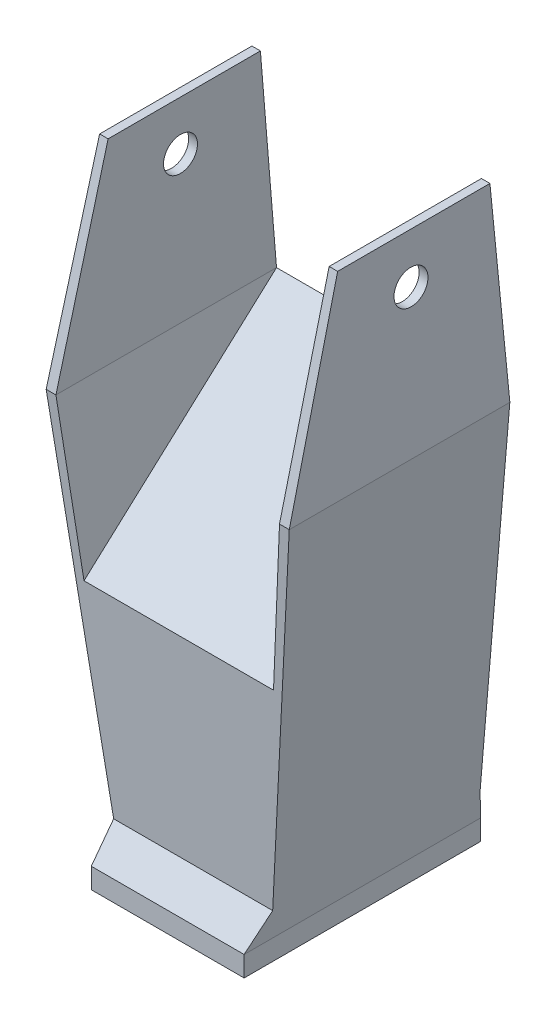
ISO-10303-21;
HEADER;
FILE_DESCRIPTION(('STEP AP214'),'2;1');
FILE_NAME('part.step','',(''),(''),'','','');
FILE_SCHEMA(('AUTOMOTIVE_DESIGN { 1 0 10303 214 1 1 1 1 }'));
ENDSEC;
DATA;
#1=APPLICATION_CONTEXT('core data for automotive mechanical design processes');
#2=APPLICATION_PROTOCOL_DEFINITION('international standard','automotive_design',2000,#1);
#3=PRODUCT_CONTEXT('',#1,'mechanical');
#4=PRODUCT('Part','Part','',(#3));
#5=PRODUCT_RELATED_PRODUCT_CATEGORY('part','',(#4));
#6=PRODUCT_DEFINITION_FORMATION('','',#4);
#7=PRODUCT_DEFINITION_CONTEXT('part definition',#1,'design');
#8=PRODUCT_DEFINITION('design','',#6,#7);
#9=PRODUCT_DEFINITION_SHAPE('','',#8);
#10=(LENGTH_UNIT() NAMED_UNIT(*) SI_UNIT(.MILLI.,.METRE.));
#11=(NAMED_UNIT(*) PLANE_ANGLE_UNIT() SI_UNIT($,.RADIAN.));
#12=(NAMED_UNIT(*) SI_UNIT($,.STERADIAN.) SOLID_ANGLE_UNIT());
#13=UNCERTAINTY_MEASURE_WITH_UNIT(LENGTH_MEASURE(1.E-05),#10,'distance_accuracy_value','');
#14=(GEOMETRIC_REPRESENTATION_CONTEXT(3) GLOBAL_UNCERTAINTY_ASSIGNED_CONTEXT((#13)) GLOBAL_UNIT_ASSIGNED_CONTEXT((#10,
#11,#12)) REPRESENTATION_CONTEXT('',''));
#15=CARTESIAN_POINT('',(0.,0.,0.));
#16=DIRECTION('',(0.,0.,1.));
#17=DIRECTION('',(1.,0.,0.));
#18=AXIS2_PLACEMENT_3D('',#15,#16,#17);
#19=CARTESIAN_POINT('',(63.6877384281737,-41.4951270591483,-111.104129621532));
#20=DIRECTION('',(0.994229338121305,-0.107275454876092,0.));
#21=DIRECTION('',(0.107275454876092,0.994229338121305,0.));
#22=AXIS2_PLACEMENT_3D('',#19,#20,#21);
#23=PLANE('',#22);
#24=DIRECTION('',(-0.0648073848721634,-0.600635098133558,0.79689239032389));
#25=VECTOR('',#24,1.);
#26=CARTESIAN_POINT('',(69.0153243654704,7.88096038173898,-33.514687286103));
#27=LINE('',#26,#25);
#28=CARTESIAN_POINT('',(68.705,5.0048729408517,-29.6988393566842));
#29=VERTEX_POINT('',#28);
#30=CARTESIAN_POINT('',(63.6877384281737,-41.4951270591483,31.9950181371733));
#31=VERTEX_POINT('',#30);
#32=EDGE_CURVE('E172',#29,#31,#27,.T.);
#33=ORIENTED_EDGE('',*,*,#32,.T.);
#34=DIRECTION('',(-0.107016413497272,-0.991828541602591,-0.0694523671638177));
#35=VECTOR('',#34,1.);
#36=CARTESIAN_POINT('',(64.2996115363484,-35.8242846837197,32.3921164361898));
#37=LINE('',#36,#35);
#38=CARTESIAN_POINT('',(68.705,5.0048729408517,35.2511606433158));
#39=VERTEX_POINT('',#38);
#40=EDGE_CURVE('E156',#39,#31,#37,.T.);
#41=ORIENTED_EDGE('',*,*,#40,.F.);
#42=DIRECTION('',(0.,0.,1.));
#43=VECTOR('',#42,1.);
#44=CARTESIAN_POINT('',(68.705,5.0048729408517,-34.3588393566842));
#45=LINE('',#44,#43);
#46=EDGE_CURVE('E217',#29,#39,#45,.T.);
#47=ORIENTED_EDGE('',*,*,#46,.F.);
#48=EDGE_LOOP('',(#33,#41,#47));
#49=FACE_BOUND('',#48,.T.);
#50=ADVANCED_FACE('F37',(#49),#23,.F.);
#51=CARTESIAN_POINT('',(2.875,5.0048729408517,-111.104129621532));
#52=DIRECTION('',(-0.994229338121305,-0.107275454876092,0.));
#53=DIRECTION('',(0.107275454876093,-0.994229338121305,0.));
#54=AXIS2_PLACEMENT_3D('',#51,#52,#53);
#55=PLANE('',#54);
#56=DIRECTION('',(0.0648073848721637,-0.600635098133558,0.796892390323889));
#57=VECTOR('',#56,1.);
#58=CARTESIAN_POINT('',(2.875,5.0048729408517,-29.6988393566842));
#59=LINE('',#58,#57);
#60=CARTESIAN_POINT('',(2.875,5.0048729408517,-29.6988393566842));
#61=VERTEX_POINT('',#60);
#62=CARTESIAN_POINT('',(7.89226157182629,-41.4951270591483,31.9950181371733));
#63=VERTEX_POINT('',#62);
#64=EDGE_CURVE('E163',#61,#63,#59,.T.);
#65=ORIENTED_EDGE('',*,*,#64,.F.);
#66=DIRECTION('',(0.,0.,1.));
#67=VECTOR('',#66,1.);
#68=CARTESIAN_POINT('',(2.875,5.0048729408517,-34.3588393566842));
#69=LINE('',#68,#67);
#70=CARTESIAN_POINT('',(2.875,5.0048729408517,35.2511606433158));
#71=VERTEX_POINT('',#70);
#72=EDGE_CURVE('E165',#61,#71,#69,.T.);
#73=ORIENTED_EDGE('',*,*,#72,.T.);
#74=DIRECTION('',(-0.107016413497273,0.991828541602591,0.0694523671638177));
#75=VECTOR('',#74,1.);
#76=CARTESIAN_POINT('',(2.28732831180685,10.4514164606137,35.6325525114072));
#77=LINE('',#76,#75);
#78=EDGE_CURVE('E154',#63,#71,#77,.T.);
#79=ORIENTED_EDGE('',*,*,#78,.F.);
#80=EDGE_LOOP('',(#65,#73,#79));
#81=FACE_BOUND('',#80,.T.);
#82=ADVANCED_FACE('F162',(#81),#55,.F.);
#83=CARTESIAN_POINT('',(0.,-115.956001694439,0.));
#84=DIRECTION('',(0.,-1.,0.));
#85=DIRECTION('',(0.,0.,-1.));
#86=AXIS2_PLACEMENT_3D('',#83,#84,#85);
#87=PLANE('',#86);
#88=DIRECTION('',(0.,0.,-1.));
#89=VECTOR('',#88,1.);
#90=CARTESIAN_POINT('',(13.29,-115.956001694439,35.2511606433158));
#91=LINE('',#90,#89);
#92=CARTESIAN_POINT('',(13.29,-115.956001694439,35.2511606433158));
#93=VERTEX_POINT('',#92);
#94=CARTESIAN_POINT('',(13.29,-115.956001694439,-34.3588393566842));
#95=VERTEX_POINT('',#94);
#96=EDGE_CURVE('E181',#93,#95,#91,.T.);
#97=ORIENTED_EDGE('',*,*,#96,.T.);
#98=DIRECTION('',(1.,0.,0.));
#99=VECTOR('',#98,1.);
#100=CARTESIAN_POINT('',(13.29,-115.956001694439,-34.3588393566842));
#101=LINE('',#100,#99);
#102=CARTESIAN_POINT('',(58.29,-115.956001694439,-34.3588393566842));
#103=VERTEX_POINT('',#102);
#104=EDGE_CURVE('E186',#95,#103,#101,.T.);
#105=ORIENTED_EDGE('',*,*,#104,.T.);
#106=DIRECTION('',(0.,0.,1.));
#107=VECTOR('',#106,1.);
#108=CARTESIAN_POINT('',(58.29,-115.956001694439,35.2511606433158));
#109=LINE('',#108,#107);
#110=CARTESIAN_POINT('',(58.29,-115.956001694439,35.2511606433158));
#111=VERTEX_POINT('',#110);
#112=EDGE_CURVE('E188',#103,#111,#109,.T.);
#113=ORIENTED_EDGE('',*,*,#112,.T.);
#114=DIRECTION('',(-1.,0.,0.));
#115=VECTOR('',#114,1.);
#116=CARTESIAN_POINT('',(13.29,-115.956001694439,35.2511606433158));
#117=LINE('',#116,#115);
#118=EDGE_CURVE('E190',#111,#93,#117,.T.);
#119=ORIENTED_EDGE('',*,*,#118,.T.);
#120=EDGE_LOOP('',(#97,#105,#113,#119));
#121=FACE_BOUND('',#120,.T.);
#122=CARTESIAN_POINT('',(35.79,-115.956001694439,0.44616064331577));
#123=DIRECTION('',(0.,-1.,0.));
#124=DIRECTION('',(0.,0.,-1.));
#125=AXIS2_PLACEMENT_3D('',#122,#123,#124);
#126=CIRCLE('',#125,4.9);
#127=CARTESIAN_POINT('',(35.79,-115.956001694439,-4.45383935668423));
#128=VERTEX_POINT('',#127);
#129=EDGE_CURVE('E166',#128,#128,#126,.T.);
#130=ORIENTED_EDGE('',*,*,#129,.F.);
#131=EDGE_LOOP('',(#130));
#132=FACE_BOUND('',#131,.T.);
#133=ADVANCED_FACE('F349',(#121,#132),#87,.T.);
#134=CARTESIAN_POINT('',(70.83,63.0048729408517,-34.3588393566842));
#135=DIRECTION('',(-0.999916404657043,-0.0129299535084963,0.));
#136=DIRECTION('',(0.0129299535084963,-0.999916404657043,0.));
#137=AXIS2_PLACEMENT_3D('',#134,#135,#136);
#138=PLANE('',#137);
#139=DIRECTION('',(0.,0.,1.));
#140=VECTOR('',#139,1.);
#141=CARTESIAN_POINT('',(70.83,63.0048729408517,-34.3588393566842));
#142=LINE('',#141,#140);
#143=CARTESIAN_POINT('',(70.83,63.0048729408517,-24.5837360482439));
#144=VERTEX_POINT('',#143);
#145=CARTESIAN_POINT('',(70.83,63.0048729408517,20.2562639517561));
#146=VERTEX_POINT('',#145);
#147=EDGE_CURVE('E235',#144,#146,#142,.T.);
#148=ORIENTED_EDGE('',*,*,#147,.T.);
#149=DIRECTION('',(-0.0125184270787468,0.968091694089753,-0.250283361048842));
#150=VECTOR('',#149,1.);
#151=CARTESIAN_POINT('',(70.8301175332624,62.9957837018932,20.2586138172593));
#152=LINE('',#151,#150);
#153=CARTESIAN_POINT('',(71.58,5.0048729408517,35.2511606433158));
#154=VERTEX_POINT('',#153);
#155=EDGE_CURVE('E237',#154,#146,#152,.T.);
#156=ORIENTED_EDGE('',*,*,#155,.F.);
#157=DIRECTION('',(0.,0.,-1.));
#158=VECTOR('',#157,1.);
#159=CARTESIAN_POINT('',(71.58,5.0048729408517,0.));
#160=LINE('',#159,#158);
#161=CARTESIAN_POINT('',(71.58,5.0048729408517,-29.6988393566842));
#162=VERTEX_POINT('',#161);
#163=EDGE_CURVE('E294',#154,#162,#160,.T.);
#164=ORIENTED_EDGE('',*,*,#163,.T.);
#165=DIRECTION('',(0.012879970404267,-0.99605104459665,-0.0878431723033063));
#166=VECTOR('',#165,1.);
#167=CARTESIAN_POINT('',(71.58,5.0048729408517,-29.6988393566842));
#168=LINE('',#167,#166);
#169=EDGE_CURVE('E240',#144,#162,#168,.T.);
#170=ORIENTED_EDGE('',*,*,#169,.F.);
#171=EDGE_LOOP('',(#148,#156,#164,#170));
#172=FACE_BOUND('',#171,.T.);
#173=CARTESIAN_POINT('',(71.0187931034483,48.4048729408517,-1.14919434830059));
#174=DIRECTION('',(-0.999916404657043,-0.0129299535084963,0.));
#175=DIRECTION('',(-0.0129299535084963,0.999916404657044,0.));
#176=AXIS2_PLACEMENT_3D('',#173,#174,#175);
#177=ELLIPSE('',#176,5.00041801165861,5.);
#178=CARTESIAN_POINT('',(70.9541379310345,53.4048729408517,-1.14919434830059));
#179=VERTEX_POINT('',#178);
#180=EDGE_CURVE('E208',#179,#179,#177,.F.);
#181=ORIENTED_EDGE('',*,*,#180,.F.);
#182=EDGE_LOOP('',(#181));
#183=FACE_BOUND('',#182,.T.);
#184=ADVANCED_FACE('F345',(#172,#183),#138,.F.);
#185=CARTESIAN_POINT('',(0.75,63.0048729408517,-34.3588393566842));
#186=DIRECTION('',(0.999916404657043,-0.0129299535084963,0.));
#187=DIRECTION('',(0.0129299535084963,0.999916404657043,0.));
#188=AXIS2_PLACEMENT_3D('',#185,#186,#187);
#189=PLANE('',#188);
#190=DIRECTION('',(0.,0.,-1.));
#191=VECTOR('',#190,1.);
#192=CARTESIAN_POINT('',(0.,5.00487294085169,0.));
#193=LINE('',#192,#191);
#194=CARTESIAN_POINT('',(0.,5.0048729408517,35.2511606433158));
#195=VERTEX_POINT('',#194);
#196=CARTESIAN_POINT('',(0.,5.0048729408517,-29.6988393566842));
#197=VERTEX_POINT('',#196);
#198=EDGE_CURVE('E291',#195,#197,#193,.T.);
#199=ORIENTED_EDGE('',*,*,#198,.F.);
#200=DIRECTION('',(-0.0125184270787468,-0.968091694089753,0.250283361048842));
#201=VECTOR('',#200,1.);
#202=CARTESIAN_POINT('',(0.76109984130053,63.8632606680927,20.0343426536306));
#203=LINE('',#202,#201);
#204=CARTESIAN_POINT('',(0.75,63.0048729408517,20.2562639517561));
#205=VERTEX_POINT('',#204);
#206=EDGE_CURVE('E229',#205,#195,#203,.T.);
#207=ORIENTED_EDGE('',*,*,#206,.F.);
#208=DIRECTION('',(0.,0.,1.));
#209=VECTOR('',#208,1.);
#210=CARTESIAN_POINT('',(0.75,63.0048729408517,-34.3588393566842));
#211=LINE('',#210,#209);
#212=CARTESIAN_POINT('',(0.75,63.0048729408517,-24.5837360482439));
#213=VERTEX_POINT('',#212);
#214=EDGE_CURVE('E226',#213,#205,#211,.T.);
#215=ORIENTED_EDGE('',*,*,#214,.F.);
#216=DIRECTION('',(0.012879970404267,0.99605104459665,0.0878431723033063));
#217=VECTOR('',#216,1.);
#218=CARTESIAN_POINT('',(0.0118746665804664,5.92318048974114,-29.6178524949344));
#219=LINE('',#218,#217);
#220=EDGE_CURVE('E232',#197,#213,#219,.T.);
#221=ORIENTED_EDGE('',*,*,#220,.F.);
#222=EDGE_LOOP('',(#199,#207,#215,#221));
#223=FACE_BOUND('',#222,.T.);
#224=CARTESIAN_POINT('',(0.561206896551716,48.4048729408517,-1.14919434830059));
#225=DIRECTION('',(0.999916404657043,-0.0129299535084963,0.));
#226=DIRECTION('',(-0.0129299535084963,-0.999916404657043,0.));
#227=AXIS2_PLACEMENT_3D('',#224,#225,#226);
#228=ELLIPSE('',#227,5.00041801165861,5.);
#229=CARTESIAN_POINT('',(0.496551724137923,43.4048729408517,-1.14919434830059));
#230=VERTEX_POINT('',#229);
#231=EDGE_CURVE('E205',#230,#230,#228,.F.);
#232=ORIENTED_EDGE('',*,*,#231,.F.);
#233=EDGE_LOOP('',(#232));
#234=FACE_BOUND('',#233,.T.);
#235=ADVANCED_FACE('F348',(#223,#234),#189,.F.);
#236=CARTESIAN_POINT('',(3.25,63.0048729408517,-34.3588393566842));
#237=DIRECTION('',(-0.999979099198684,0.00646538210688806,0.));
#238=DIRECTION('',(-0.00646538210688806,-0.999979099198684,0.));
#239=AXIS2_PLACEMENT_3D('',#236,#237,#238);
#240=PLANE('',#239);
#241=DIRECTION('',(0.,0.,1.));
#242=VECTOR('',#241,1.);
#243=CARTESIAN_POINT('',(3.25,63.0048729408517,-34.3588393566842));
#244=LINE('',#243,#242);
#245=CARTESIAN_POINT('',(3.25,63.0048729408517,-24.5837360482439));
#246=VERTEX_POINT('',#245);
#247=CARTESIAN_POINT('',(3.25,63.0048729408517,20.2562639517561));
#248=VERTEX_POINT('',#247);
#249=EDGE_CURVE('E211',#246,#248,#244,.T.);
#250=ORIENTED_EDGE('',*,*,#249,.T.);
#251=DIRECTION('',(0.0062595814046947,0.968148590592778,-0.25029807065548));
#252=VECTOR('',#251,1.);
#253=CARTESIAN_POINT('',(3.25267733061521,63.4189667426701,20.149207162465));
#254=LINE('',#253,#252);
#255=EDGE_CURVE('E11',#71,#248,#254,.T.);
#256=ORIENTED_EDGE('',*,*,#255,.F.);
#257=ORIENTED_EDGE('',*,*,#72,.F.);
#258=DIRECTION('',(-0.00644038587173673,-0.996113014828612,-0.0878486375470741));
#259=VECTOR('',#258,1.);
#260=CARTESIAN_POINT('',(2.87784978516399,5.44563971288394,-29.6599675019623));
#261=LINE('',#260,#259);
#262=EDGE_CURVE('E223',#246,#61,#261,.T.);
#263=ORIENTED_EDGE('',*,*,#262,.F.);
#264=EDGE_LOOP('',(#250,#256,#257,#263));
#265=FACE_BOUND('',#264,.T.);
#266=CARTESIAN_POINT('',(3.15560344827587,48.4048729408517,-1.14919434830059));
#267=DIRECTION('',(-0.999979099198684,0.00646538210688806,0.));
#268=DIRECTION('',(-0.00646538210688806,-0.999979099198684,0.));
#269=AXIS2_PLACEMENT_3D('',#266,#267,#268);
#270=ELLIPSE('',#269,5.00010450619084,5.);
#271=CARTESIAN_POINT('',(3.12327586206897,43.4048729408517,-1.14919434830059));
#272=VERTEX_POINT('',#271);
#273=EDGE_CURVE('E202',#272,#272,#270,.F.);
#274=ORIENTED_EDGE('',*,*,#273,.F.);
#275=EDGE_LOOP('',(#274));
#276=FACE_BOUND('',#275,.T.);
#277=ADVANCED_FACE('F479',(#265,#276),#240,.F.);
#278=CARTESIAN_POINT('',(68.33,63.0048729408517,-34.3588393566842));
#279=DIRECTION('',(0.999979099198684,0.00646538210688805,0.));
#280=DIRECTION('',(-0.00646538210688805,0.999979099198684,0.));
#281=AXIS2_PLACEMENT_3D('',#278,#279,#280);
#282=PLANE('',#281);
#283=ORIENTED_EDGE('',*,*,#46,.T.);
#284=DIRECTION('',(0.00625958140469469,-0.968148590592778,0.25029807065548));
#285=VECTOR('',#284,1.);
#286=CARTESIAN_POINT('',(68.3301273426679,62.9851772748791,20.2613559254894));
#287=LINE('',#286,#285);
#288=CARTESIAN_POINT('',(68.33,63.0048729408517,20.2562639517561));
#289=VERTEX_POINT('',#288);
#290=EDGE_CURVE('E46',#289,#39,#287,.T.);
#291=ORIENTED_EDGE('',*,*,#290,.F.);
#292=DIRECTION('',(0.,0.,1.));
#293=VECTOR('',#292,1.);
#294=CARTESIAN_POINT('',(68.33,63.0048729408517,-34.3588393566842));
#295=LINE('',#294,#293);
#296=CARTESIAN_POINT('',(68.33,63.0048729408517,-24.5837360482439));
#297=VERTEX_POINT('',#296);
#298=EDGE_CURVE('E214',#297,#289,#295,.T.);
#299=ORIENTED_EDGE('',*,*,#298,.F.);
#300=DIRECTION('',(-0.00644038587173672,0.996113014828612,0.0878486375470741));
#301=VECTOR('',#300,1.);
#302=CARTESIAN_POINT('',(68.7051192508893,4.98642880331305,-29.7004659716661));
#303=LINE('',#302,#301);
#304=EDGE_CURVE('E213',#29,#297,#303,.T.);
#305=ORIENTED_EDGE('',*,*,#304,.F.);
#306=EDGE_LOOP('',(#283,#291,#299,#305));
#307=FACE_BOUND('',#306,.T.);
#308=CARTESIAN_POINT('',(68.4243965517241,48.4048729408517,-1.14919434830059));
#309=DIRECTION('',(0.999979099198684,0.00646538210688805,0.));
#310=DIRECTION('',(-0.00646538210688805,0.999979099198684,0.));
#311=AXIS2_PLACEMENT_3D('',#308,#309,#310);
#312=ELLIPSE('',#311,5.00010450619084,5.);
#313=CARTESIAN_POINT('',(68.3920689655172,53.4048729408517,-1.14919434830059));
#314=VERTEX_POINT('',#313);
#315=EDGE_CURVE('E41',#314,#314,#312,.F.);
#316=ORIENTED_EDGE('',*,*,#315,.F.);
#317=EDGE_LOOP('',(#316));
#318=FACE_BOUND('',#317,.T.);
#319=ADVANCED_FACE('F339',(#307,#318),#282,.F.);
#320=CARTESIAN_POINT('',(71.58,5.0048729408517,-29.6988393566842));
#321=DIRECTION('',(0.,-0.0878504595216927,0.996133674143098));
#322=DIRECTION('',(0.,-0.996133674143098,-0.0878504595216927));
#323=AXIS2_PLACEMENT_3D('',#320,#321,#322);
#324=PLANE('',#323);
#325=DIRECTION('',(-1.,0.,0.));
#326=VECTOR('',#325,1.);
#327=CARTESIAN_POINT('',(71.58,63.0048729408517,-24.5837360482439));
#328=LINE('',#327,#326);
#329=EDGE_CURVE('E276',#246,#213,#328,.T.);
#330=ORIENTED_EDGE('',*,*,#329,.F.);
#331=ORIENTED_EDGE('',*,*,#262,.T.);
#332=DIRECTION('',(-1.,0.,0.));
#333=VECTOR('',#332,1.);
#334=CARTESIAN_POINT('',(71.58,5.0048729408517,-29.6988393566842));
#335=LINE('',#334,#333);
#336=EDGE_CURVE('E280',#61,#197,#335,.T.);
#337=ORIENTED_EDGE('',*,*,#336,.T.);
#338=ORIENTED_EDGE('',*,*,#220,.T.);
#339=EDGE_LOOP('',(#330,#331,#337,#338));
#340=FACE_BOUND('',#339,.T.);
#341=ADVANCED_FACE('F447',(#340),#324,.F.);
#342=CARTESIAN_POINT('',(71.58,63.0048729408517,-24.5837360482439));
#343=DIRECTION('',(0.,-1.,0.));
#344=DIRECTION('',(0.,0.,-1.));
#345=AXIS2_PLACEMENT_3D('',#342,#343,#344);
#346=PLANE('',#345);
#347=DIRECTION('',(-1.,0.,0.));
#348=VECTOR('',#347,1.);
#349=CARTESIAN_POINT('',(71.58,63.0048729408517,20.2562639517561));
#350=LINE('',#349,#348);
#351=EDGE_CURVE('E272',#248,#205,#350,.T.);
#352=ORIENTED_EDGE('',*,*,#351,.F.);
#353=ORIENTED_EDGE('',*,*,#249,.F.);
#354=ORIENTED_EDGE('',*,*,#329,.T.);
#355=ORIENTED_EDGE('',*,*,#214,.T.);
#356=EDGE_LOOP('',(#352,#353,#354,#355));
#357=FACE_BOUND('',#356,.T.);
#358=ADVANCED_FACE('F468',(#357),#346,.F.);
#359=CARTESIAN_POINT('',(71.58,63.0048729408517,20.2562639517561));
#360=DIRECTION('',(0.,-0.250302974434062,-0.968167558323176));
#361=DIRECTION('',(0.,0.968167558323177,-0.250302974434062));
#362=AXIS2_PLACEMENT_3D('',#359,#360,#361);
#363=PLANE('',#362);
#364=DIRECTION('',(-1.,0.,0.));
#365=VECTOR('',#364,1.);
#366=CARTESIAN_POINT('',(71.58,5.0048729408517,35.2511606433158));
#367=LINE('',#366,#365);
#368=EDGE_CURVE('E269',#71,#195,#367,.T.);
#369=ORIENTED_EDGE('',*,*,#368,.F.);
#370=ORIENTED_EDGE('',*,*,#255,.T.);
#371=ORIENTED_EDGE('',*,*,#351,.T.);
#372=ORIENTED_EDGE('',*,*,#206,.T.);
#373=EDGE_LOOP('',(#369,#370,#371,#372));
#374=FACE_BOUND('',#373,.T.);
#375=ADVANCED_FACE('F507',(#374),#363,.F.);
#376=CARTESIAN_POINT('',(71.58,-102.063950804145,27.7537122975359));
#377=DIRECTION('',(0.,-0.688749461914693,-0.724999433594414));
#378=DIRECTION('',(0.,0.724999433594414,-0.688749461914693));
#379=AXIS2_PLACEMENT_3D('',#376,#377,#378);
#380=PLANE('',#379);
#381=DIRECTION('',(-1.,0.,0.));
#382=VECTOR('',#381,1.);
#383=CARTESIAN_POINT('',(71.58,-109.956001694439,35.2511606433158));
#384=LINE('',#383,#382);
#385=CARTESIAN_POINT('',(58.29,-109.956001694439,35.2511606433158));
#386=VERTEX_POINT('',#385);
#387=CARTESIAN_POINT('',(13.29,-109.956001694439,35.2511606433158));
#388=VERTEX_POINT('',#387);
#389=EDGE_CURVE('E288',#386,#388,#384,.T.);
#390=ORIENTED_EDGE('',*,*,#389,.F.);
#391=DIRECTION('',(0.0835203944097176,0.722466334930445,-0.686343018183922));
#392=VECTOR('',#391,1.);
#393=CARTESIAN_POINT('',(59.2886991627024,-101.317075491144,27.0441807501849));
#394=LINE('',#393,#392);
#395=CARTESIAN_POINT('',(59.202356979405,-102.063950804145,27.7537122975359));
#396=VERTEX_POINT('',#395);
#397=EDGE_CURVE('E248',#386,#396,#394,.T.);
#398=ORIENTED_EDGE('',*,*,#397,.T.);
#399=DIRECTION('',(-1.,0.,0.));
#400=VECTOR('',#399,1.);
#401=CARTESIAN_POINT('',(71.58,-102.063950804145,27.7537122975359));
#402=LINE('',#401,#400);
#403=CARTESIAN_POINT('',(12.377643020595,-102.063950804145,27.7537122975359));
#404=VERTEX_POINT('',#403);
#405=EDGE_CURVE('E61',#396,#404,#402,.T.);
#406=ORIENTED_EDGE('',*,*,#405,.T.);
#407=DIRECTION('',(0.0835203944097178,-0.722466334930445,0.686343018183922));
#408=VECTOR('',#407,1.);
#409=CARTESIAN_POINT('',(12.7906183139886,-105.636260881744,31.1474068712552));
#410=LINE('',#409,#408);
#411=EDGE_CURVE('E261',#404,#388,#410,.T.);
#412=ORIENTED_EDGE('',*,*,#411,.T.);
#413=EDGE_LOOP('',(#390,#398,#406,#412));
#414=FACE_BOUND('',#413,.T.);
#415=ADVANCED_FACE('F39',(#414),#380,.F.);
#416=CARTESIAN_POINT('',(71.58,-109.956001694439,-34.3588393566842));
#417=DIRECTION('',(0.,-0.130963717783499,0.991387161821417));
#418=DIRECTION('',(0.,-0.991387161821417,-0.130963717783499));
#419=AXIS2_PLACEMENT_3D('',#416,#417,#418);
#420=PLANE('',#419);
#421=DIRECTION('',(-1.,0.,0.));
#422=VECTOR('',#421,1.);
#423=CARTESIAN_POINT('',(71.58,-102.063950804145,-33.3162877024641));
#424=LINE('',#423,#422);
#425=CARTESIAN_POINT('',(59.202356979405,-102.063950804145,-33.3162877024641));
#426=VERTEX_POINT('',#425);
#427=CARTESIAN_POINT('',(12.377643020595,-102.063950804145,-33.3162877024641));
#428=VERTEX_POINT('',#427);
#429=EDGE_CURVE('E53',#426,#428,#424,.T.);
#430=ORIENTED_EDGE('',*,*,#429,.F.);
#431=DIRECTION('',(-0.113863495390557,-0.984939580069965,-0.130111982649738));
#432=VECTOR('',#431,1.);
#433=CARTESIAN_POINT('',(58.4623034622922,-108.465545958714,-34.1619479384176));
#434=LINE('',#433,#432);
#435=CARTESIAN_POINT('',(58.29,-109.956001694439,-34.3588393566842));
#436=VERTEX_POINT('',#435);
#437=EDGE_CURVE('E252',#426,#436,#434,.T.);
#438=ORIENTED_EDGE('',*,*,#437,.T.);
#439=DIRECTION('',(-1.,0.,0.));
#440=VECTOR('',#439,1.);
#441=CARTESIAN_POINT('',(71.58,-109.956001694439,-34.3588393566842));
#442=LINE('',#441,#440);
#443=CARTESIAN_POINT('',(13.29,-109.956001694439,-34.3588393566842));
#444=VERTEX_POINT('',#443);
#445=EDGE_CURVE('E285',#436,#444,#442,.T.);
#446=ORIENTED_EDGE('',*,*,#445,.T.);
#447=DIRECTION('',(-0.113863495390557,0.984939580069965,0.130111982649738));
#448=VECTOR('',#447,1.);
#449=CARTESIAN_POINT('',(14.0457237635072,-116.493147280252,-35.2224060061022));
#450=LINE('',#449,#448);
#451=EDGE_CURVE('E265',#444,#428,#450,.T.);
#452=ORIENTED_EDGE('',*,*,#451,.T.);
#453=EDGE_LOOP('',(#430,#438,#446,#452));
#454=FACE_BOUND('',#453,.T.);
#455=ADVANCED_FACE('F324',(#454),#420,.F.);
#456=CARTESIAN_POINT('',(71.58,-102.063950804145,-33.3162877024641));
#457=DIRECTION('',(0.,-0.0337669296607647,0.999429734629346));
#458=DIRECTION('',(0.,-0.999429734629346,-0.0337669296607647));
#459=AXIS2_PLACEMENT_3D('',#456,#457,#458);
#460=PLANE('',#459);
#461=DIRECTION('',(-1.,0.,0.));
#462=VECTOR('',#461,1.);
#463=CARTESIAN_POINT('',(142.591804102939,5.0048729408517,-29.6988393566842));
#464=LINE('',#463,#462);
#465=EDGE_CURVE('E171',#29,#61,#464,.T.);
#466=ORIENTED_EDGE('',*,*,#465,.F.);
#467=EDGE_CURVE('E281',#162,#29,#335,.T.);
#468=ORIENTED_EDGE('',*,*,#467,.F.);
#469=DIRECTION('',(-0.114775086594136,-0.992825006862536,-0.033543781028897));
#470=VECTOR('',#469,1.);
#471=CARTESIAN_POINT('',(59.3654116379832,-100.653498873106,-33.2686338960032));
#472=LINE('',#471,#470);
#473=EDGE_CURVE('E250',#162,#426,#472,.T.);
#474=ORIENTED_EDGE('',*,*,#473,.T.);
#475=ORIENTED_EDGE('',*,*,#429,.T.);
#476=DIRECTION('',(-0.114775086594136,0.992825006862536,0.033543781028897));
#477=VECTOR('',#476,1.);
#478=CARTESIAN_POINT('',(13.1575346435994,-108.810152692883,-33.5442162068514));
#479=LINE('',#478,#477);
#480=EDGE_CURVE('E263',#428,#197,#479,.T.);
#481=ORIENTED_EDGE('',*,*,#480,.T.);
#482=ORIENTED_EDGE('',*,*,#336,.F.);
#483=EDGE_LOOP('',(#466,#468,#474,#475,#481,#482));
#484=FACE_BOUND('',#483,.T.);
#485=ADVANCED_FACE('F332',(#484),#460,.F.);
#486=ORIENTED_EDGE('',*,*,#467,.T.);
#487=ORIENTED_EDGE('',*,*,#304,.T.);
#488=EDGE_CURVE('E277',#144,#297,#328,.T.);
#489=ORIENTED_EDGE('',*,*,#488,.F.);
#490=ORIENTED_EDGE('',*,*,#169,.T.);
#491=EDGE_LOOP('',(#486,#487,#489,#490));
#492=FACE_BOUND('',#491,.T.);
#493=ADVANCED_FACE('F335',(#492),#324,.F.);
#494=ORIENTED_EDGE('',*,*,#488,.T.);
#495=ORIENTED_EDGE('',*,*,#298,.T.);
#496=EDGE_CURVE('E273',#146,#289,#350,.T.);
#497=ORIENTED_EDGE('',*,*,#496,.F.);
#498=ORIENTED_EDGE('',*,*,#147,.F.);
#499=EDGE_LOOP('',(#494,#495,#497,#498));
#500=FACE_BOUND('',#499,.T.);
#501=ADVANCED_FACE('F342',(#500),#346,.F.);
#502=ORIENTED_EDGE('',*,*,#496,.T.);
#503=ORIENTED_EDGE('',*,*,#290,.T.);
#504=EDGE_CURVE('E270',#154,#39,#367,.T.);
#505=ORIENTED_EDGE('',*,*,#504,.F.);
#506=ORIENTED_EDGE('',*,*,#155,.T.);
#507=EDGE_LOOP('',(#502,#503,#505,#506));
#508=FACE_BOUND('',#507,.T.);
#509=ADVANCED_FACE('F299',(#508),#363,.F.);
#510=CARTESIAN_POINT('',(71.58,5.0048729408517,35.2511606433158));
#511=DIRECTION('',(0.,0.0698535181720021,-0.997557259508944));
#512=DIRECTION('',(0.,0.997557259508944,0.0698535181720021));
#513=AXIS2_PLACEMENT_3D('',#510,#511,#512);
#514=PLANE('',#513);
#515=ORIENTED_EDGE('',*,*,#504,.T.);
#516=ORIENTED_EDGE('',*,*,#40,.T.);
#517=DIRECTION('',(-1.,0.,0.));
#518=VECTOR('',#517,1.);
#519=CARTESIAN_POINT('',(7.89226157182628,-41.4951270591483,31.9950181371733));
#520=LINE('',#519,#518);
#521=EDGE_CURVE('E150',#31,#63,#520,.T.);
#522=ORIENTED_EDGE('',*,*,#521,.T.);
#523=ORIENTED_EDGE('',*,*,#78,.T.);
#524=ORIENTED_EDGE('',*,*,#368,.T.);
#525=DIRECTION('',(0.114562875360707,-0.990989341775823,-0.0693936025567835));
#526=VECTOR('',#525,1.);
#527=CARTESIAN_POINT('',(0.939462619573145,-3.12164658008812,34.6821046080657));
#528=LINE('',#527,#526);
#529=EDGE_CURVE('E258',#195,#404,#528,.T.);
#530=ORIENTED_EDGE('',*,*,#529,.T.);
#531=ORIENTED_EDGE('',*,*,#405,.F.);
#532=DIRECTION('',(0.114562875360707,0.990989341775823,0.0693936025567835));
#533=VECTOR('',#532,1.);
#534=CARTESIAN_POINT('',(71.58,5.0048729408517,35.2511606433158));
#535=LINE('',#534,#533);
#536=EDGE_CURVE('E245',#396,#154,#535,.T.);
#537=ORIENTED_EDGE('',*,*,#536,.T.);
#538=EDGE_LOOP('',(#515,#516,#522,#523,#524,#530,#531,#537));
#539=FACE_BOUND('',#538,.T.);
#540=ADVANCED_FACE('F153',(#539),#514,.F.);
#541=CARTESIAN_POINT('',(0.,5.0048729408517,-34.3588393566842));
#542=DIRECTION('',(0.993384034688841,0.114839712753559,0.));
#543=DIRECTION('',(-0.114839712753559,0.993384034688841,0.));
#544=AXIS2_PLACEMENT_3D('',#541,#542,#543);
#545=PLANE('',#544);
#546=DIRECTION('',(0.,0.,1.));
#547=VECTOR('',#546,1.);
#548=CARTESIAN_POINT('',(13.29,-109.956001694439,-34.3588393566842));
#549=LINE('',#548,#547);
#550=EDGE_CURVE('E255',#444,#388,#549,.T.);
#551=ORIENTED_EDGE('',*,*,#550,.T.);
#552=ORIENTED_EDGE('',*,*,#411,.F.);
#553=ORIENTED_EDGE('',*,*,#529,.F.);
#554=ORIENTED_EDGE('',*,*,#198,.T.);
#555=ORIENTED_EDGE('',*,*,#480,.F.);
#556=ORIENTED_EDGE('',*,*,#451,.F.);
#557=EDGE_LOOP('',(#551,#552,#553,#554,#555,#556));
#558=FACE_BOUND('',#557,.T.);
#559=ADVANCED_FACE('F318',(#558),#545,.F.);
#560=CARTESIAN_POINT('',(58.29,-109.956001694439,-34.3588393566842));
#561=DIRECTION('',(-0.993384034688841,0.114839712753559,0.));
#562=DIRECTION('',(-0.114839712753559,-0.993384034688841,0.));
#563=AXIS2_PLACEMENT_3D('',#560,#561,#562);
#564=PLANE('',#563);
#565=ORIENTED_EDGE('',*,*,#473,.F.);
#566=ORIENTED_EDGE('',*,*,#163,.F.);
#567=ORIENTED_EDGE('',*,*,#536,.F.);
#568=ORIENTED_EDGE('',*,*,#397,.F.);
#569=DIRECTION('',(0.,0.,1.));
#570=VECTOR('',#569,1.);
#571=CARTESIAN_POINT('',(58.29,-109.956001694439,-34.3588393566842));
#572=LINE('',#571,#570);
#573=EDGE_CURVE('E243',#436,#386,#572,.T.);
#574=ORIENTED_EDGE('',*,*,#573,.F.);
#575=ORIENTED_EDGE('',*,*,#437,.F.);
#576=EDGE_LOOP('',(#565,#566,#567,#568,#574,#575));
#577=FACE_BOUND('',#576,.T.);
#578=ADVANCED_FACE('F306',(#577),#564,.F.);
#579=CARTESIAN_POINT('',(71.58,48.4048729408517,-1.14919434830059));
#580=DIRECTION('',(-1.,0.,0.));
#581=DIRECTION('',(0.,0.,1.));
#582=AXIS2_PLACEMENT_3D('',#579,#580,#581);
#583=CYLINDRICAL_SURFACE('',#582,5.);
#584=ORIENTED_EDGE('',*,*,#315,.T.);
#585=EDGE_LOOP('',(#584));
#586=FACE_BOUND('',#585,.T.);
#587=ORIENTED_EDGE('',*,*,#180,.T.);
#588=EDGE_LOOP('',(#587));
#589=FACE_BOUND('',#588,.T.);
#590=ADVANCED_FACE('F353',(#586,#589),#583,.F.);
#591=ORIENTED_EDGE('',*,*,#273,.T.);
#592=EDGE_LOOP('',(#591));
#593=FACE_BOUND('',#592,.T.);
#594=ORIENTED_EDGE('',*,*,#231,.T.);
#595=EDGE_LOOP('',(#594));
#596=FACE_BOUND('',#595,.T.);
#597=ADVANCED_FACE('F355',(#593,#596),#583,.F.);
#598=CARTESIAN_POINT('',(13.29,-115.956001694439,35.2511606433158));
#599=DIRECTION('',(1.,0.,0.));
#600=DIRECTION('',(0.,0.,-1.));
#601=AXIS2_PLACEMENT_3D('',#598,#599,#600);
#602=PLANE('',#601);
#603=ORIENTED_EDGE('',*,*,#550,.F.);
#604=DIRECTION('',(0.,1.,0.));
#605=VECTOR('',#604,1.);
#606=CARTESIAN_POINT('',(13.29,-115.956001694439,-34.3588393566842));
#607=LINE('',#606,#605);
#608=EDGE_CURVE('E200',#95,#444,#607,.T.);
#609=ORIENTED_EDGE('',*,*,#608,.F.);
#610=ORIENTED_EDGE('',*,*,#96,.F.);
#611=DIRECTION('',(0.,1.,0.));
#612=VECTOR('',#611,1.);
#613=CARTESIAN_POINT('',(13.29,-115.956001694439,35.2511606433158));
#614=LINE('',#613,#612);
#615=EDGE_CURVE('E192',#93,#388,#614,.T.);
#616=ORIENTED_EDGE('',*,*,#615,.T.);
#617=EDGE_LOOP('',(#603,#609,#610,#616));
#618=FACE_BOUND('',#617,.T.);
#619=ADVANCED_FACE('F322',(#618),#602,.F.);
#620=CARTESIAN_POINT('',(13.29,-115.956001694439,-34.3588393566842));
#621=DIRECTION('',(0.,0.,1.));
#622=DIRECTION('',(1.,0.,0.));
#623=AXIS2_PLACEMENT_3D('',#620,#621,#622);
#624=PLANE('',#623);
#625=ORIENTED_EDGE('',*,*,#445,.F.);
#626=DIRECTION('',(0.,1.,0.));
#627=VECTOR('',#626,1.);
#628=CARTESIAN_POINT('',(58.29,-115.956001694439,-34.3588393566842));
#629=LINE('',#628,#627);
#630=EDGE_CURVE('E197',#103,#436,#629,.T.);
#631=ORIENTED_EDGE('',*,*,#630,.F.);
#632=ORIENTED_EDGE('',*,*,#104,.F.);
#633=ORIENTED_EDGE('',*,*,#608,.T.);
#634=EDGE_LOOP('',(#625,#631,#632,#633));
#635=FACE_BOUND('',#634,.T.);
#636=ADVANCED_FACE('F327',(#635),#624,.F.);
#637=CARTESIAN_POINT('',(58.29,-115.956001694439,35.2511606433158));
#638=DIRECTION('',(-1.,0.,0.));
#639=DIRECTION('',(0.,0.,1.));
#640=AXIS2_PLACEMENT_3D('',#637,#638,#639);
#641=PLANE('',#640);
#642=ORIENTED_EDGE('',*,*,#573,.T.);
#643=DIRECTION('',(0.,1.,0.));
#644=VECTOR('',#643,1.);
#645=CARTESIAN_POINT('',(58.29,-115.956001694439,35.2511606433158));
#646=LINE('',#645,#644);
#647=EDGE_CURVE('E194',#111,#386,#646,.T.);
#648=ORIENTED_EDGE('',*,*,#647,.F.);
#649=ORIENTED_EDGE('',*,*,#112,.F.);
#650=ORIENTED_EDGE('',*,*,#630,.T.);
#651=EDGE_LOOP('',(#642,#648,#649,#650));
#652=FACE_BOUND('',#651,.T.);
#653=ADVANCED_FACE('F330',(#652),#641,.F.);
#654=CARTESIAN_POINT('',(13.29,-115.956001694439,35.2511606433158));
#655=DIRECTION('',(0.,0.,-1.));
#656=DIRECTION('',(-1.,0.,0.));
#657=AXIS2_PLACEMENT_3D('',#654,#655,#656);
#658=PLANE('',#657);
#659=ORIENTED_EDGE('',*,*,#389,.T.);
#660=ORIENTED_EDGE('',*,*,#615,.F.);
#661=ORIENTED_EDGE('',*,*,#118,.F.);
#662=ORIENTED_EDGE('',*,*,#647,.T.);
#663=EDGE_LOOP('',(#659,#660,#661,#662));
#664=FACE_BOUND('',#663,.T.);
#665=ADVANCED_FACE('F311',(#664),#658,.F.);
#666=CARTESIAN_POINT('',(35.79,-125.956001694439,0.44616064331577));
#667=DIRECTION('',(0.,1.,0.));
#668=DIRECTION('',(0.,0.,1.));
#669=AXIS2_PLACEMENT_3D('',#666,#667,#668);
#670=CYLINDRICAL_SURFACE('',#669,4.9);
#671=CARTESIAN_POINT('',(35.79,-125.956001694439,0.44616064331577));
#672=DIRECTION('',(0.,-1.,0.));
#673=DIRECTION('',(0.,0.,-1.));
#674=AXIS2_PLACEMENT_3D('',#671,#672,#673);
#675=CIRCLE('',#674,4.9);
#676=CARTESIAN_POINT('',(35.79,-125.956001694439,-4.45383935668423));
#677=VERTEX_POINT('',#676);
#678=EDGE_CURVE('E178',#677,#677,#675,.T.);
#679=ORIENTED_EDGE('',*,*,#678,.F.);
#680=EDGE_LOOP('',(#679));
#681=FACE_BOUND('',#680,.T.);
#682=ORIENTED_EDGE('',*,*,#129,.T.);
#683=EDGE_LOOP('',(#682));
#684=FACE_BOUND('',#683,.T.);
#685=ADVANCED_FACE('F378',(#681,#684),#670,.T.);
#686=CARTESIAN_POINT('',(35.79,-125.956001694439,0.44616064331577));
#687=DIRECTION('',(0.,-1.,0.));
#688=DIRECTION('',(0.,0.,-1.));
#689=AXIS2_PLACEMENT_3D('',#686,#687,#688);
#690=PLANE('',#689);
#691=ORIENTED_EDGE('',*,*,#678,.T.);
#692=EDGE_LOOP('',(#691));
#693=FACE_BOUND('',#692,.T.);
#694=ADVANCED_FACE('F375',(#693),#690,.T.);
#695=CARTESIAN_POINT('',(142.591804102939,5.0048729408517,-29.6988393566842));
#696=DIRECTION('',(0.,-0.798571153155652,-0.601900418132145));
#697=DIRECTION('',(0.,0.601900418132145,-0.798571153155652));
#698=AXIS2_PLACEMENT_3D('',#695,#696,#697);
#699=PLANE('',#698);
#700=ORIENTED_EDGE('',*,*,#32,.F.);
#701=ORIENTED_EDGE('',*,*,#465,.T.);
#702=ORIENTED_EDGE('',*,*,#64,.T.);
#703=ORIENTED_EDGE('',*,*,#521,.F.);
#704=EDGE_LOOP('',(#700,#701,#702,#703));
#705=FACE_BOUND('',#704,.T.);
#706=ADVANCED_FACE('F169',(#705),#699,.F.);
#707=CLOSED_SHELL('',(#50,#82,#133,#184,#235,#277,#319,#341,#358,#375,#415,#455,#485,#493,#501,
#509,#540,#559,#578,#590,#597,#619,#636,#653,#665,#685,#694,#706));
#708=MANIFOLD_SOLID_BREP('B2',#707);
#709=ADVANCED_BREP_SHAPE_REPRESENTATION('',(#18,#708),#14);
#710=SHAPE_DEFINITION_REPRESENTATION(#9,#709);
ENDSEC;
END-ISO-10303-21;
